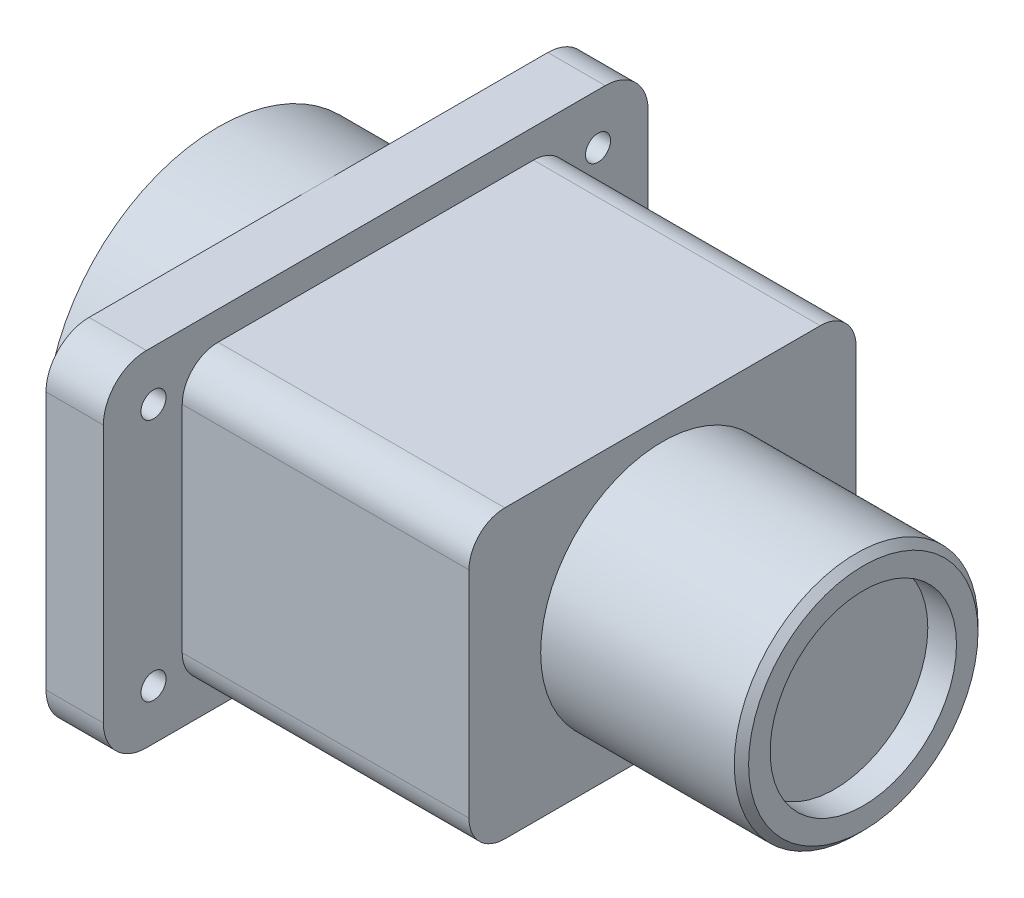
ISO-10303-21;
HEADER;
FILE_DESCRIPTION(('STEP AP214'),'2;1');
FILE_NAME('part.step','',(''),(''),'','','');
FILE_SCHEMA(('AUTOMOTIVE_DESIGN { 1 0 10303 214 1 1 1 1 }'));
ENDSEC;
DATA;
#1=APPLICATION_CONTEXT('core data for automotive mechanical design processes');
#2=APPLICATION_PROTOCOL_DEFINITION('international standard','automotive_design',2000,#1);
#3=PRODUCT_CONTEXT('',#1,'mechanical');
#4=PRODUCT('Part','Part','',(#3));
#5=PRODUCT_RELATED_PRODUCT_CATEGORY('part','',(#4));
#6=PRODUCT_DEFINITION_FORMATION('','',#4);
#7=PRODUCT_DEFINITION_CONTEXT('part definition',#1,'design');
#8=PRODUCT_DEFINITION('design','',#6,#7);
#9=PRODUCT_DEFINITION_SHAPE('','',#8);
#10=(LENGTH_UNIT() NAMED_UNIT(*) SI_UNIT(.MILLI.,.METRE.));
#11=(NAMED_UNIT(*) PLANE_ANGLE_UNIT() SI_UNIT($,.RADIAN.));
#12=(NAMED_UNIT(*) SI_UNIT($,.STERADIAN.) SOLID_ANGLE_UNIT());
#13=UNCERTAINTY_MEASURE_WITH_UNIT(LENGTH_MEASURE(1.E-05),#10,'distance_accuracy_value','');
#14=(GEOMETRIC_REPRESENTATION_CONTEXT(3) GLOBAL_UNCERTAINTY_ASSIGNED_CONTEXT((#13)) GLOBAL_UNIT_ASSIGNED_CONTEXT((#10,
#11,#12)) REPRESENTATION_CONTEXT('',''));
#15=CARTESIAN_POINT('',(0.,0.,0.));
#16=DIRECTION('',(0.,0.,1.));
#17=DIRECTION('',(1.,0.,0.));
#18=AXIS2_PLACEMENT_3D('',#15,#16,#17);
#19=CARTESIAN_POINT('',(22.,-18.,32.));
#20=DIRECTION('',(-1.,0.,0.));
#21=DIRECTION('',(0.,0.,1.));
#22=AXIS2_PLACEMENT_3D('',#19,#20,#21);
#23=PLANE('',#22);
#24=CARTESIAN_POINT('',(22.,-18.,32.));
#25=DIRECTION('',(1.,0.,0.));
#26=DIRECTION('',(0.,0.,1.));
#27=AXIS2_PLACEMENT_3D('',#24,#25,#26);
#28=CIRCLE('',#27,6.);
#29=CARTESIAN_POINT('',(22.,-17.9999999999999,38.));
#30=VERTEX_POINT('',#29);
#31=CARTESIAN_POINT('',(22.,-24.,32.));
#32=VERTEX_POINT('',#31);
#33=EDGE_CURVE('E810',#30,#32,#28,.T.);
#34=ORIENTED_EDGE('',*,*,#33,.T.);
#35=DIRECTION('',(0.,0.,-1.));
#36=VECTOR('',#35,1.);
#37=CARTESIAN_POINT('',(22.,-24.,32.));
#38=LINE('',#37,#36);
#39=CARTESIAN_POINT('',(22.,-24.,-32.));
#40=VERTEX_POINT('',#39);
#41=EDGE_CURVE('E807',#32,#40,#38,.T.);
#42=ORIENTED_EDGE('',*,*,#41,.T.);
#43=CARTESIAN_POINT('',(22.,-18.,-32.));
#44=DIRECTION('',(1.,0.,0.));
#45=DIRECTION('',(0.,0.,-1.));
#46=AXIS2_PLACEMENT_3D('',#43,#44,#45);
#47=CIRCLE('',#46,6.);
#48=CARTESIAN_POINT('',(22.,-18.,-38.));
#49=VERTEX_POINT('',#48);
#50=EDGE_CURVE('E812',#40,#49,#47,.T.);
#51=ORIENTED_EDGE('',*,*,#50,.T.);
#52=DIRECTION('',(0.,1.,0.));
#53=VECTOR('',#52,1.);
#54=CARTESIAN_POINT('',(22.,-17.9999999999999,-38.));
#55=LINE('',#54,#53);
#56=CARTESIAN_POINT('',(22.,17.9999999999999,-38.));
#57=VERTEX_POINT('',#56);
#58=EDGE_CURVE('E820',#49,#57,#55,.T.);
#59=ORIENTED_EDGE('',*,*,#58,.T.);
#60=CARTESIAN_POINT('',(22.,18.,-32.));
#61=DIRECTION('',(1.,0.,0.));
#62=DIRECTION('',(0.,0.,1.));
#63=AXIS2_PLACEMENT_3D('',#60,#61,#62);
#64=CIRCLE('',#63,6.);
#65=CARTESIAN_POINT('',(22.,24.,-32.));
#66=VERTEX_POINT('',#65);
#67=EDGE_CURVE('E819',#57,#66,#64,.T.);
#68=ORIENTED_EDGE('',*,*,#67,.T.);
#69=DIRECTION('',(0.,0.,1.));
#70=VECTOR('',#69,1.);
#71=CARTESIAN_POINT('',(22.,24.,32.));
#72=LINE('',#71,#70);
#73=CARTESIAN_POINT('',(22.,24.,32.));
#74=VERTEX_POINT('',#73);
#75=EDGE_CURVE('E822',#66,#74,#72,.T.);
#76=ORIENTED_EDGE('',*,*,#75,.T.);
#77=CARTESIAN_POINT('',(22.,18.,32.));
#78=DIRECTION('',(1.,0.,0.));
#79=DIRECTION('',(0.,0.,1.));
#80=AXIS2_PLACEMENT_3D('',#77,#78,#79);
#81=CIRCLE('',#80,6.);
#82=CARTESIAN_POINT('',(22.,18.,38.));
#83=VERTEX_POINT('',#82);
#84=EDGE_CURVE('E827',#74,#83,#81,.T.);
#85=ORIENTED_EDGE('',*,*,#84,.T.);
#86=DIRECTION('',(0.,-1.,0.));
#87=VECTOR('',#86,1.);
#88=CARTESIAN_POINT('',(22.,-17.9999999999999,38.));
#89=LINE('',#88,#87);
#90=EDGE_CURVE('E826',#83,#30,#89,.T.);
#91=ORIENTED_EDGE('',*,*,#90,.T.);
#92=EDGE_LOOP('',(#34,#42,#51,#59,#68,#76,#85,#91));
#93=FACE_BOUND('',#92,.T.);
#94=CARTESIAN_POINT('',(22.,17.,-31.));
#95=DIRECTION('',(1.,0.,0.));
#96=DIRECTION('',(0.,0.,-1.));
#97=AXIS2_PLACEMENT_3D('',#94,#95,#96);
#98=CIRCLE('',#97,1.75);
#99=CARTESIAN_POINT('',(22.,17.,-32.75));
#100=VERTEX_POINT('',#99);
#101=EDGE_CURVE('E801',#100,#100,#98,.T.);
#102=ORIENTED_EDGE('',*,*,#101,.F.);
#103=EDGE_LOOP('',(#102));
#104=FACE_BOUND('',#103,.T.);
#105=CARTESIAN_POINT('',(22.,17.,31.));
#106=DIRECTION('',(1.,0.,0.));
#107=DIRECTION('',(0.,0.,-1.));
#108=AXIS2_PLACEMENT_3D('',#105,#106,#107);
#109=CIRCLE('',#108,1.75);
#110=CARTESIAN_POINT('',(22.,17.,29.25));
#111=VERTEX_POINT('',#110);
#112=EDGE_CURVE('E236',#111,#111,#109,.T.);
#113=ORIENTED_EDGE('',*,*,#112,.F.);
#114=EDGE_LOOP('',(#113));
#115=FACE_BOUND('',#114,.T.);
#116=CARTESIAN_POINT('',(22.,-17.,31.));
#117=DIRECTION('',(1.,0.,0.));
#118=DIRECTION('',(0.,0.,-1.));
#119=AXIS2_PLACEMENT_3D('',#116,#117,#118);
#120=CIRCLE('',#119,1.75);
#121=CARTESIAN_POINT('',(22.,-17.,29.25));
#122=VERTEX_POINT('',#121);
#123=EDGE_CURVE('E783',#122,#122,#120,.T.);
#124=ORIENTED_EDGE('',*,*,#123,.F.);
#125=EDGE_LOOP('',(#124));
#126=FACE_BOUND('',#125,.T.);
#127=CARTESIAN_POINT('',(22.,-17.,-31.));
#128=DIRECTION('',(1.,0.,0.));
#129=DIRECTION('',(0.,0.,-1.));
#130=AXIS2_PLACEMENT_3D('',#127,#128,#129);
#131=CIRCLE('',#130,1.75);
#132=CARTESIAN_POINT('',(22.,-17.,-32.75));
#133=VERTEX_POINT('',#132);
#134=EDGE_CURVE('E231',#133,#133,#131,.T.);
#135=ORIENTED_EDGE('',*,*,#134,.F.);
#136=EDGE_LOOP('',(#135));
#137=FACE_BOUND('',#136,.T.);
#138=CARTESIAN_POINT('',(22.,-15.,22.));
#139=DIRECTION('',(1.,0.,0.));
#140=DIRECTION('',(0.,0.,1.));
#141=AXIS2_PLACEMENT_3D('',#138,#139,#140);
#142=CIRCLE('',#141,5.);
#143=CARTESIAN_POINT('',(22.,-15.,27.));
#144=VERTEX_POINT('',#143);
#145=CARTESIAN_POINT('',(22.,-20.,22.));
#146=VERTEX_POINT('',#145);
#147=EDGE_CURVE('E100',#144,#146,#142,.T.);
#148=ORIENTED_EDGE('',*,*,#147,.F.);
#149=DIRECTION('',(0.,-1.,0.));
#150=VECTOR('',#149,1.);
#151=CARTESIAN_POINT('',(22.,-15.,27.));
#152=LINE('',#151,#150);
#153=CARTESIAN_POINT('',(22.,15.,27.));
#154=VERTEX_POINT('',#153);
#155=EDGE_CURVE('E101',#154,#144,#152,.T.);
#156=ORIENTED_EDGE('',*,*,#155,.F.);
#157=CARTESIAN_POINT('',(22.,15.,22.));
#158=DIRECTION('',(1.,0.,0.));
#159=DIRECTION('',(0.,0.,1.));
#160=AXIS2_PLACEMENT_3D('',#157,#158,#159);
#161=CIRCLE('',#160,5.);
#162=CARTESIAN_POINT('',(22.,20.,22.));
#163=VERTEX_POINT('',#162);
#164=EDGE_CURVE('E289',#163,#154,#161,.T.);
#165=ORIENTED_EDGE('',*,*,#164,.F.);
#166=DIRECTION('',(0.,0.,1.));
#167=VECTOR('',#166,1.);
#168=CARTESIAN_POINT('',(22.,20.,22.));
#169=LINE('',#168,#167);
#170=CARTESIAN_POINT('',(22.,20.,-22.));
#171=VERTEX_POINT('',#170);
#172=EDGE_CURVE('E286',#171,#163,#169,.T.);
#173=ORIENTED_EDGE('',*,*,#172,.F.);
#174=CARTESIAN_POINT('',(22.,15.,-22.));
#175=DIRECTION('',(1.,0.,0.));
#176=DIRECTION('',(0.,0.,1.));
#177=AXIS2_PLACEMENT_3D('',#174,#175,#176);
#178=CIRCLE('',#177,5.);
#179=CARTESIAN_POINT('',(22.,15.,-27.));
#180=VERTEX_POINT('',#179);
#181=EDGE_CURVE('E279',#180,#171,#178,.T.);
#182=ORIENTED_EDGE('',*,*,#181,.F.);
#183=DIRECTION('',(0.,1.,0.));
#184=VECTOR('',#183,1.);
#185=CARTESIAN_POINT('',(22.,-15.,-27.));
#186=LINE('',#185,#184);
#187=CARTESIAN_POINT('',(22.,-15.,-27.));
#188=VERTEX_POINT('',#187);
#189=EDGE_CURVE('E266',#188,#180,#186,.T.);
#190=ORIENTED_EDGE('',*,*,#189,.F.);
#191=CARTESIAN_POINT('',(22.,-15.,-22.));
#192=DIRECTION('',(1.,0.,0.));
#193=DIRECTION('',(0.,0.,-1.));
#194=AXIS2_PLACEMENT_3D('',#191,#192,#193);
#195=CIRCLE('',#194,5.);
#196=CARTESIAN_POINT('',(22.,-20.,-22.));
#197=VERTEX_POINT('',#196);
#198=EDGE_CURVE('E271',#197,#188,#195,.T.);
#199=ORIENTED_EDGE('',*,*,#198,.F.);
#200=DIRECTION('',(0.,0.,-1.));
#201=VECTOR('',#200,1.);
#202=CARTESIAN_POINT('',(22.,-20.,22.));
#203=LINE('',#202,#201);
#204=EDGE_CURVE('E272',#146,#197,#203,.T.);
#205=ORIENTED_EDGE('',*,*,#204,.F.);
#206=EDGE_LOOP('',(#148,#156,#165,#173,#182,#190,#199,#205));
#207=FACE_BOUND('',#206,.T.);
#208=ADVANCED_FACE('F81',(#93,#104,#115,#126,#137,#207),#23,.F.);
#209=CARTESIAN_POINT('',(14.,0.,0.));
#210=DIRECTION('',(-1.,0.,0.));
#211=DIRECTION('',(0.,0.,1.));
#212=AXIS2_PLACEMENT_3D('',#209,#210,#211);
#213=CYLINDRICAL_SURFACE('',#212,24.);
#214=CARTESIAN_POINT('',(14.,0.,0.));
#215=DIRECTION('',(1.,0.,0.));
#216=DIRECTION('',(0.,0.,-1.));
#217=AXIS2_PLACEMENT_3D('',#214,#215,#216);
#218=CIRCLE('',#217,24.);
#219=CARTESIAN_POINT('',(14.,24.,0.));
#220=VERTEX_POINT('',#219);
#221=CARTESIAN_POINT('',(14.,-24.,0.));
#222=VERTEX_POINT('',#221);
#223=EDGE_CURVE('E322',#220,#222,#218,.T.);
#224=ORIENTED_EDGE('',*,*,#223,.F.);
#225=EDGE_CURVE('E423',#222,#220,#218,.T.);
#226=ORIENTED_EDGE('',*,*,#225,.F.);
#227=EDGE_LOOP('',(#224,#226));
#228=FACE_BOUND('',#227,.T.);
#229=CARTESIAN_POINT('',(0.,0.,0.));
#230=DIRECTION('',(1.,0.,0.));
#231=DIRECTION('',(0.,0.,-1.));
#232=AXIS2_PLACEMENT_3D('',#229,#230,#231);
#233=CIRCLE('',#232,24.);
#234=CARTESIAN_POINT('',(0.,0.,-24.));
#235=VERTEX_POINT('',#234);
#236=EDGE_CURVE('E416',#235,#235,#233,.T.);
#237=ORIENTED_EDGE('',*,*,#236,.T.);
#238=EDGE_LOOP('',(#237));
#239=FACE_BOUND('',#238,.T.);
#240=ADVANCED_FACE('F360',(#228,#239),#213,.T.);
#241=CARTESIAN_POINT('',(0.,0.,0.));
#242=DIRECTION('',(1.,0.,0.));
#243=DIRECTION('',(0.,0.,-1.));
#244=AXIS2_PLACEMENT_3D('',#241,#242,#243);
#245=PLANE('',#244);
#246=ORIENTED_EDGE('',*,*,#236,.F.);
#247=EDGE_LOOP('',(#246));
#248=FACE_BOUND('',#247,.T.);
#249=ADVANCED_FACE('F365',(#248),#245,.F.);
#250=CARTESIAN_POINT('',(14.,-18.,32.));
#251=DIRECTION('',(-1.,0.,0.));
#252=DIRECTION('',(0.,0.,1.));
#253=AXIS2_PLACEMENT_3D('',#250,#251,#252);
#254=PLANE('',#253);
#255=CARTESIAN_POINT('',(14.,-17.,31.));
#256=DIRECTION('',(1.,0.,0.));
#257=DIRECTION('',(0.,0.,-1.));
#258=AXIS2_PLACEMENT_3D('',#255,#256,#257);
#259=CIRCLE('',#258,1.75);
#260=CARTESIAN_POINT('',(14.,-17.,29.25));
#261=VERTEX_POINT('',#260);
#262=EDGE_CURVE('E781',#261,#261,#259,.T.);
#263=ORIENTED_EDGE('',*,*,#262,.T.);
#264=EDGE_LOOP('',(#263));
#265=FACE_BOUND('',#264,.T.);
#266=CARTESIAN_POINT('',(14.,17.,31.));
#267=DIRECTION('',(1.,0.,0.));
#268=DIRECTION('',(0.,0.,-1.));
#269=AXIS2_PLACEMENT_3D('',#266,#267,#268);
#270=CIRCLE('',#269,1.75);
#271=CARTESIAN_POINT('',(14.,17.,29.25));
#272=VERTEX_POINT('',#271);
#273=EDGE_CURVE('E790',#272,#272,#270,.T.);
#274=ORIENTED_EDGE('',*,*,#273,.T.);
#275=EDGE_LOOP('',(#274));
#276=FACE_BOUND('',#275,.T.);
#277=DIRECTION('',(0.,0.,1.));
#278=VECTOR('',#277,1.);
#279=CARTESIAN_POINT('',(14.,24.,32.));
#280=LINE('',#279,#278);
#281=CARTESIAN_POINT('',(14.,24.,32.));
#282=VERTEX_POINT('',#281);
#283=EDGE_CURVE('E847',#220,#282,#280,.T.);
#284=ORIENTED_EDGE('',*,*,#283,.F.);
#285=ORIENTED_EDGE('',*,*,#223,.T.);
#286=DIRECTION('',(0.,0.,-1.));
#287=VECTOR('',#286,1.);
#288=CARTESIAN_POINT('',(14.,-24.,32.));
#289=LINE('',#288,#287);
#290=CARTESIAN_POINT('',(14.,-24.,32.));
#291=VERTEX_POINT('',#290);
#292=EDGE_CURVE('E840',#291,#222,#289,.T.);
#293=ORIENTED_EDGE('',*,*,#292,.F.);
#294=CARTESIAN_POINT('',(14.,-18.,32.));
#295=DIRECTION('',(1.,0.,0.));
#296=DIRECTION('',(0.,0.,1.));
#297=AXIS2_PLACEMENT_3D('',#294,#295,#296);
#298=CIRCLE('',#297,6.);
#299=CARTESIAN_POINT('',(14.,-17.9999999999999,38.));
#300=VERTEX_POINT('',#299);
#301=EDGE_CURVE('E802',#300,#291,#298,.T.);
#302=ORIENTED_EDGE('',*,*,#301,.F.);
#303=DIRECTION('',(0.,-1.,0.));
#304=VECTOR('',#303,1.);
#305=CARTESIAN_POINT('',(14.,-17.9999999999999,38.));
#306=LINE('',#305,#304);
#307=CARTESIAN_POINT('',(14.,18.,38.));
#308=VERTEX_POINT('',#307);
#309=EDGE_CURVE('E811',#308,#300,#306,.T.);
#310=ORIENTED_EDGE('',*,*,#309,.F.);
#311=CARTESIAN_POINT('',(14.,18.,32.));
#312=DIRECTION('',(1.,0.,0.));
#313=DIRECTION('',(0.,0.,1.));
#314=AXIS2_PLACEMENT_3D('',#311,#312,#313);
#315=CIRCLE('',#314,6.);
#316=EDGE_CURVE('E854',#282,#308,#315,.T.);
#317=ORIENTED_EDGE('',*,*,#316,.F.);
#318=EDGE_LOOP('',(#284,#285,#293,#302,#310,#317));
#319=FACE_BOUND('',#318,.T.);
#320=ADVANCED_FACE('F380',(#265,#276,#319),#254,.T.);
#321=CARTESIAN_POINT('',(22.,-18.,32.));
#322=DIRECTION('',(-1.,0.,0.));
#323=DIRECTION('',(0.,0.,1.));
#324=AXIS2_PLACEMENT_3D('',#321,#322,#323);
#325=CYLINDRICAL_SURFACE('',#324,6.);
#326=ORIENTED_EDGE('',*,*,#301,.T.);
#327=DIRECTION('',(-1.,0.,0.));
#328=VECTOR('',#327,1.);
#329=CARTESIAN_POINT('',(22.,-24.,32.));
#330=LINE('',#329,#328);
#331=EDGE_CURVE('E425',#32,#291,#330,.T.);
#332=ORIENTED_EDGE('',*,*,#331,.F.);
#333=ORIENTED_EDGE('',*,*,#33,.F.);
#334=DIRECTION('',(-1.,0.,0.));
#335=VECTOR('',#334,1.);
#336=CARTESIAN_POINT('',(22.,-17.9999999999999,38.));
#337=LINE('',#336,#335);
#338=EDGE_CURVE('E831',#30,#300,#337,.T.);
#339=ORIENTED_EDGE('',*,*,#338,.T.);
#340=EDGE_LOOP('',(#326,#332,#333,#339));
#341=FACE_BOUND('',#340,.T.);
#342=ADVANCED_FACE('F404',(#341),#325,.T.);
#343=CARTESIAN_POINT('',(22.,-24.,32.));
#344=DIRECTION('',(0.,1.,0.));
#345=DIRECTION('',(0.,0.,1.));
#346=AXIS2_PLACEMENT_3D('',#343,#344,#345);
#347=PLANE('',#346);
#348=ORIENTED_EDGE('',*,*,#292,.T.);
#349=CARTESIAN_POINT('',(14.,-24.,-32.));
#350=VERTEX_POINT('',#349);
#351=EDGE_CURVE('E836',#222,#350,#289,.T.);
#352=ORIENTED_EDGE('',*,*,#351,.T.);
#353=DIRECTION('',(-1.,0.,0.));
#354=VECTOR('',#353,1.);
#355=CARTESIAN_POINT('',(22.,-24.,-32.));
#356=LINE('',#355,#354);
#357=EDGE_CURVE('E429',#40,#350,#356,.T.);
#358=ORIENTED_EDGE('',*,*,#357,.F.);
#359=ORIENTED_EDGE('',*,*,#41,.F.);
#360=ORIENTED_EDGE('',*,*,#331,.T.);
#361=EDGE_LOOP('',(#348,#352,#358,#359,#360));
#362=FACE_BOUND('',#361,.T.);
#363=ADVANCED_FACE('F399',(#362),#347,.F.);
#364=CARTESIAN_POINT('',(22.,-18.,-32.));
#365=DIRECTION('',(-1.,0.,0.));
#366=DIRECTION('',(0.,0.,1.));
#367=AXIS2_PLACEMENT_3D('',#364,#365,#366);
#368=CYLINDRICAL_SURFACE('',#367,6.);
#369=CARTESIAN_POINT('',(14.,-18.,-32.));
#370=DIRECTION('',(1.,0.,0.));
#371=DIRECTION('',(0.,0.,-1.));
#372=AXIS2_PLACEMENT_3D('',#369,#370,#371);
#373=CIRCLE('',#372,6.);
#374=CARTESIAN_POINT('',(14.,-18.,-38.));
#375=VERTEX_POINT('',#374);
#376=EDGE_CURVE('E842',#350,#375,#373,.T.);
#377=ORIENTED_EDGE('',*,*,#376,.T.);
#378=DIRECTION('',(-1.,0.,0.));
#379=VECTOR('',#378,1.);
#380=CARTESIAN_POINT('',(22.,-18.,-38.));
#381=LINE('',#380,#379);
#382=EDGE_CURVE('E878',#49,#375,#381,.T.);
#383=ORIENTED_EDGE('',*,*,#382,.F.);
#384=ORIENTED_EDGE('',*,*,#50,.F.);
#385=ORIENTED_EDGE('',*,*,#357,.T.);
#386=EDGE_LOOP('',(#377,#383,#384,#385));
#387=FACE_BOUND('',#386,.T.);
#388=ADVANCED_FACE('F396',(#387),#368,.T.);
#389=CARTESIAN_POINT('',(22.,-17.9999999999999,-38.));
#390=DIRECTION('',(0.,0.,1.));
#391=DIRECTION('',(1.,0.,0.));
#392=AXIS2_PLACEMENT_3D('',#389,#390,#391);
#393=PLANE('',#392);
#394=DIRECTION('',(0.,1.,0.));
#395=VECTOR('',#394,1.);
#396=CARTESIAN_POINT('',(14.,-17.9999999999999,-38.));
#397=LINE('',#396,#395);
#398=CARTESIAN_POINT('',(14.,17.9999999999999,-38.));
#399=VERTEX_POINT('',#398);
#400=EDGE_CURVE('E844',#375,#399,#397,.T.);
#401=ORIENTED_EDGE('',*,*,#400,.T.);
#402=DIRECTION('',(-1.,0.,0.));
#403=VECTOR('',#402,1.);
#404=CARTESIAN_POINT('',(22.,17.9999999999999,-38.));
#405=LINE('',#404,#403);
#406=EDGE_CURVE('E874',#57,#399,#405,.T.);
#407=ORIENTED_EDGE('',*,*,#406,.F.);
#408=ORIENTED_EDGE('',*,*,#58,.F.);
#409=ORIENTED_EDGE('',*,*,#382,.T.);
#410=EDGE_LOOP('',(#401,#407,#408,#409));
#411=FACE_BOUND('',#410,.T.);
#412=ADVANCED_FACE('F391',(#411),#393,.F.);
#413=CARTESIAN_POINT('',(22.,18.,-32.));
#414=DIRECTION('',(-1.,0.,0.));
#415=DIRECTION('',(0.,0.,1.));
#416=AXIS2_PLACEMENT_3D('',#413,#414,#415);
#417=CYLINDRICAL_SURFACE('',#416,6.);
#418=CARTESIAN_POINT('',(14.,18.,-32.));
#419=DIRECTION('',(1.,0.,0.));
#420=DIRECTION('',(0.,0.,1.));
#421=AXIS2_PLACEMENT_3D('',#418,#419,#420);
#422=CIRCLE('',#421,6.);
#423=CARTESIAN_POINT('',(14.,24.,-32.));
#424=VERTEX_POINT('',#423);
#425=EDGE_CURVE('E846',#399,#424,#422,.T.);
#426=ORIENTED_EDGE('',*,*,#425,.T.);
#427=DIRECTION('',(-1.,0.,0.));
#428=VECTOR('',#427,1.);
#429=CARTESIAN_POINT('',(22.,24.,-32.));
#430=LINE('',#429,#428);
#431=EDGE_CURVE('E871',#66,#424,#430,.T.);
#432=ORIENTED_EDGE('',*,*,#431,.F.);
#433=ORIENTED_EDGE('',*,*,#67,.F.);
#434=ORIENTED_EDGE('',*,*,#406,.T.);
#435=EDGE_LOOP('',(#426,#432,#433,#434));
#436=FACE_BOUND('',#435,.T.);
#437=ADVANCED_FACE('F389',(#436),#417,.T.);
#438=CARTESIAN_POINT('',(22.,24.,32.));
#439=DIRECTION('',(0.,-1.,0.));
#440=DIRECTION('',(0.,0.,-1.));
#441=AXIS2_PLACEMENT_3D('',#438,#439,#440);
#442=PLANE('',#441);
#443=EDGE_CURVE('E851',#424,#220,#280,.T.);
#444=ORIENTED_EDGE('',*,*,#443,.T.);
#445=ORIENTED_EDGE('',*,*,#283,.T.);
#446=DIRECTION('',(-1.,0.,0.));
#447=VECTOR('',#446,1.);
#448=CARTESIAN_POINT('',(22.,24.,32.));
#449=LINE('',#448,#447);
#450=EDGE_CURVE('E870',#74,#282,#449,.T.);
#451=ORIENTED_EDGE('',*,*,#450,.F.);
#452=ORIENTED_EDGE('',*,*,#75,.F.);
#453=ORIENTED_EDGE('',*,*,#431,.T.);
#454=EDGE_LOOP('',(#444,#445,#451,#452,#453));
#455=FACE_BOUND('',#454,.T.);
#456=ADVANCED_FACE('F383',(#455),#442,.F.);
#457=CARTESIAN_POINT('',(22.,18.,32.));
#458=DIRECTION('',(-1.,0.,0.));
#459=DIRECTION('',(0.,0.,1.));
#460=AXIS2_PLACEMENT_3D('',#457,#458,#459);
#461=CYLINDRICAL_SURFACE('',#460,6.);
#462=ORIENTED_EDGE('',*,*,#316,.T.);
#463=DIRECTION('',(-1.,0.,0.));
#464=VECTOR('',#463,1.);
#465=CARTESIAN_POINT('',(22.,18.,38.));
#466=LINE('',#465,#464);
#467=EDGE_CURVE('E861',#83,#308,#466,.T.);
#468=ORIENTED_EDGE('',*,*,#467,.F.);
#469=ORIENTED_EDGE('',*,*,#84,.F.);
#470=ORIENTED_EDGE('',*,*,#450,.T.);
#471=EDGE_LOOP('',(#462,#468,#469,#470));
#472=FACE_BOUND('',#471,.T.);
#473=ADVANCED_FACE('F379',(#472),#461,.T.);
#474=CARTESIAN_POINT('',(22.,-17.9999999999999,38.));
#475=DIRECTION('',(0.,0.,-1.));
#476=DIRECTION('',(-1.,0.,0.));
#477=AXIS2_PLACEMENT_3D('',#474,#475,#476);
#478=PLANE('',#477);
#479=ORIENTED_EDGE('',*,*,#309,.T.);
#480=ORIENTED_EDGE('',*,*,#338,.F.);
#481=ORIENTED_EDGE('',*,*,#90,.F.);
#482=ORIENTED_EDGE('',*,*,#467,.T.);
#483=EDGE_LOOP('',(#479,#480,#481,#482));
#484=FACE_BOUND('',#483,.T.);
#485=ADVANCED_FACE('F374',(#484),#478,.F.);
#486=CARTESIAN_POINT('',(14.,-17.,-31.));
#487=DIRECTION('',(1.,0.,0.));
#488=DIRECTION('',(0.,0.,-1.));
#489=AXIS2_PLACEMENT_3D('',#486,#487,#488);
#490=CIRCLE('',#489,1.75);
#491=CARTESIAN_POINT('',(14.,-17.,-32.75));
#492=VERTEX_POINT('',#491);
#493=EDGE_CURVE('E221',#492,#492,#490,.T.);
#494=ORIENTED_EDGE('',*,*,#493,.T.);
#495=EDGE_LOOP('',(#494));
#496=FACE_BOUND('',#495,.T.);
#497=CARTESIAN_POINT('',(14.,17.,-31.));
#498=DIRECTION('',(1.,0.,0.));
#499=DIRECTION('',(0.,0.,-1.));
#500=AXIS2_PLACEMENT_3D('',#497,#498,#499);
#501=CIRCLE('',#500,1.75);
#502=CARTESIAN_POINT('',(14.,17.,-32.75));
#503=VERTEX_POINT('',#502);
#504=EDGE_CURVE('E797',#503,#503,#501,.T.);
#505=ORIENTED_EDGE('',*,*,#504,.T.);
#506=EDGE_LOOP('',(#505));
#507=FACE_BOUND('',#506,.T.);
#508=ORIENTED_EDGE('',*,*,#351,.F.);
#509=ORIENTED_EDGE('',*,*,#225,.T.);
#510=ORIENTED_EDGE('',*,*,#443,.F.);
#511=ORIENTED_EDGE('',*,*,#425,.F.);
#512=ORIENTED_EDGE('',*,*,#400,.F.);
#513=ORIENTED_EDGE('',*,*,#376,.F.);
#514=EDGE_LOOP('',(#508,#509,#510,#511,#512,#513));
#515=FACE_BOUND('',#514,.T.);
#516=ADVANCED_FACE('F375',(#496,#507,#515),#254,.T.);
#517=CARTESIAN_POINT('',(14.,17.,-31.));
#518=DIRECTION('',(1.,0.,0.));
#519=DIRECTION('',(0.,0.,-1.));
#520=AXIS2_PLACEMENT_3D('',#517,#518,#519);
#521=CYLINDRICAL_SURFACE('',#520,1.75);
#522=ORIENTED_EDGE('',*,*,#504,.F.);
#523=EDGE_LOOP('',(#522));
#524=FACE_BOUND('',#523,.T.);
#525=ORIENTED_EDGE('',*,*,#101,.T.);
#526=EDGE_LOOP('',(#525));
#527=FACE_BOUND('',#526,.T.);
#528=ADVANCED_FACE('F367',(#524,#527),#521,.F.);
#529=CARTESIAN_POINT('',(14.,-17.,-31.));
#530=DIRECTION('',(1.,0.,0.));
#531=DIRECTION('',(0.,0.,-1.));
#532=AXIS2_PLACEMENT_3D('',#529,#530,#531);
#533=CYLINDRICAL_SURFACE('',#532,1.75);
#534=ORIENTED_EDGE('',*,*,#493,.F.);
#535=EDGE_LOOP('',(#534));
#536=FACE_BOUND('',#535,.T.);
#537=ORIENTED_EDGE('',*,*,#134,.T.);
#538=EDGE_LOOP('',(#537));
#539=FACE_BOUND('',#538,.T.);
#540=ADVANCED_FACE('F511',(#536,#539),#533,.F.);
#541=CARTESIAN_POINT('',(14.,17.,31.));
#542=DIRECTION('',(1.,0.,0.));
#543=DIRECTION('',(0.,0.,-1.));
#544=AXIS2_PLACEMENT_3D('',#541,#542,#543);
#545=CYLINDRICAL_SURFACE('',#544,1.75);
#546=ORIENTED_EDGE('',*,*,#273,.F.);
#547=EDGE_LOOP('',(#546));
#548=FACE_BOUND('',#547,.T.);
#549=ORIENTED_EDGE('',*,*,#112,.T.);
#550=EDGE_LOOP('',(#549));
#551=FACE_BOUND('',#550,.T.);
#552=ADVANCED_FACE('F525',(#548,#551),#545,.F.);
#553=CARTESIAN_POINT('',(14.,-17.,31.));
#554=DIRECTION('',(1.,0.,0.));
#555=DIRECTION('',(0.,0.,-1.));
#556=AXIS2_PLACEMENT_3D('',#553,#554,#555);
#557=CYLINDRICAL_SURFACE('',#556,1.75);
#558=ORIENTED_EDGE('',*,*,#262,.F.);
#559=EDGE_LOOP('',(#558));
#560=FACE_BOUND('',#559,.T.);
#561=ORIENTED_EDGE('',*,*,#123,.T.);
#562=EDGE_LOOP('',(#561));
#563=FACE_BOUND('',#562,.T.);
#564=ADVANCED_FACE('F533',(#560,#563),#557,.F.);
#565=CARTESIAN_POINT('',(62.,-15.,22.));
#566=DIRECTION('',(-1.,0.,0.));
#567=DIRECTION('',(0.,0.,1.));
#568=AXIS2_PLACEMENT_3D('',#565,#566,#567);
#569=CYLINDRICAL_SURFACE('',#568,5.);
#570=ORIENTED_EDGE('',*,*,#147,.T.);
#571=DIRECTION('',(-1.,0.,0.));
#572=VECTOR('',#571,1.);
#573=CARTESIAN_POINT('',(62.,-20.,22.));
#574=LINE('',#573,#572);
#575=CARTESIAN_POINT('',(62.,-20.,22.));
#576=VERTEX_POINT('',#575);
#577=EDGE_CURVE('E204',#576,#146,#574,.T.);
#578=ORIENTED_EDGE('',*,*,#577,.F.);
#579=CARTESIAN_POINT('',(62.,-15.,22.));
#580=DIRECTION('',(1.,0.,0.));
#581=DIRECTION('',(0.,0.,1.));
#582=AXIS2_PLACEMENT_3D('',#579,#580,#581);
#583=CIRCLE('',#582,5.);
#584=CARTESIAN_POINT('',(62.,-15.,27.));
#585=VERTEX_POINT('',#584);
#586=EDGE_CURVE('E211',#585,#576,#583,.T.);
#587=ORIENTED_EDGE('',*,*,#586,.F.);
#588=DIRECTION('',(-1.,0.,0.));
#589=VECTOR('',#588,1.);
#590=CARTESIAN_POINT('',(62.,-15.,27.));
#591=LINE('',#590,#589);
#592=EDGE_CURVE('E294',#585,#144,#591,.T.);
#593=ORIENTED_EDGE('',*,*,#592,.T.);
#594=EDGE_LOOP('',(#570,#578,#587,#593));
#595=FACE_BOUND('',#594,.T.);
#596=ADVANCED_FACE('F225',(#595),#569,.T.);
#597=CARTESIAN_POINT('',(62.,-20.,22.));
#598=DIRECTION('',(0.,1.,0.));
#599=DIRECTION('',(0.,0.,1.));
#600=AXIS2_PLACEMENT_3D('',#597,#598,#599);
#601=PLANE('',#600);
#602=ORIENTED_EDGE('',*,*,#204,.T.);
#603=DIRECTION('',(-1.,0.,0.));
#604=VECTOR('',#603,1.);
#605=CARTESIAN_POINT('',(62.,-20.,-22.));
#606=LINE('',#605,#604);
#607=CARTESIAN_POINT('',(62.,-20.,-22.));
#608=VERTEX_POINT('',#607);
#609=EDGE_CURVE('E206',#608,#197,#606,.T.);
#610=ORIENTED_EDGE('',*,*,#609,.F.);
#611=DIRECTION('',(0.,0.,-1.));
#612=VECTOR('',#611,1.);
#613=CARTESIAN_POINT('',(62.,-20.,22.));
#614=LINE('',#613,#612);
#615=EDGE_CURVE('E200',#576,#608,#614,.T.);
#616=ORIENTED_EDGE('',*,*,#615,.F.);
#617=ORIENTED_EDGE('',*,*,#577,.T.);
#618=EDGE_LOOP('',(#602,#610,#616,#617));
#619=FACE_BOUND('',#618,.T.);
#620=ADVANCED_FACE('F205',(#619),#601,.F.);
#621=CARTESIAN_POINT('',(62.,-15.,-22.));
#622=DIRECTION('',(-1.,0.,0.));
#623=DIRECTION('',(0.,0.,1.));
#624=AXIS2_PLACEMENT_3D('',#621,#622,#623);
#625=CYLINDRICAL_SURFACE('',#624,5.);
#626=ORIENTED_EDGE('',*,*,#198,.T.);
#627=DIRECTION('',(-1.,0.,0.));
#628=VECTOR('',#627,1.);
#629=CARTESIAN_POINT('',(62.,-15.,-27.));
#630=LINE('',#629,#628);
#631=CARTESIAN_POINT('',(62.,-15.,-27.));
#632=VERTEX_POINT('',#631);
#633=EDGE_CURVE('E232',#632,#188,#630,.T.);
#634=ORIENTED_EDGE('',*,*,#633,.F.);
#635=CARTESIAN_POINT('',(62.,-15.,-22.));
#636=DIRECTION('',(1.,0.,0.));
#637=DIRECTION('',(0.,0.,-1.));
#638=AXIS2_PLACEMENT_3D('',#635,#636,#637);
#639=CIRCLE('',#638,5.);
#640=EDGE_CURVE('E209',#608,#632,#639,.T.);
#641=ORIENTED_EDGE('',*,*,#640,.F.);
#642=ORIENTED_EDGE('',*,*,#609,.T.);
#643=EDGE_LOOP('',(#626,#634,#641,#642));
#644=FACE_BOUND('',#643,.T.);
#645=ADVANCED_FACE('F269',(#644),#625,.T.);
#646=CARTESIAN_POINT('',(62.,-15.,-27.));
#647=DIRECTION('',(0.,0.,1.));
#648=DIRECTION('',(1.,0.,0.));
#649=AXIS2_PLACEMENT_3D('',#646,#647,#648);
#650=PLANE('',#649);
#651=ORIENTED_EDGE('',*,*,#189,.T.);
#652=DIRECTION('',(-1.,0.,0.));
#653=VECTOR('',#652,1.);
#654=CARTESIAN_POINT('',(62.,15.,-27.));
#655=LINE('',#654,#653);
#656=CARTESIAN_POINT('',(62.,15.,-27.));
#657=VERTEX_POINT('',#656);
#658=EDGE_CURVE('E255',#657,#180,#655,.T.);
#659=ORIENTED_EDGE('',*,*,#658,.F.);
#660=DIRECTION('',(0.,1.,0.));
#661=VECTOR('',#660,1.);
#662=CARTESIAN_POINT('',(62.,-15.,-27.));
#663=LINE('',#662,#661);
#664=EDGE_CURVE('E270',#632,#657,#663,.T.);
#665=ORIENTED_EDGE('',*,*,#664,.F.);
#666=ORIENTED_EDGE('',*,*,#633,.T.);
#667=EDGE_LOOP('',(#651,#659,#665,#666));
#668=FACE_BOUND('',#667,.T.);
#669=ADVANCED_FACE('F262',(#668),#650,.F.);
#670=CARTESIAN_POINT('',(62.,15.,-22.));
#671=DIRECTION('',(-1.,0.,0.));
#672=DIRECTION('',(0.,0.,1.));
#673=AXIS2_PLACEMENT_3D('',#670,#671,#672);
#674=CYLINDRICAL_SURFACE('',#673,5.);
#675=ORIENTED_EDGE('',*,*,#181,.T.);
#676=DIRECTION('',(-1.,0.,0.));
#677=VECTOR('',#676,1.);
#678=CARTESIAN_POINT('',(62.,20.,-22.));
#679=LINE('',#678,#677);
#680=CARTESIAN_POINT('',(62.,20.,-22.));
#681=VERTEX_POINT('',#680);
#682=EDGE_CURVE('E247',#681,#171,#679,.T.);
#683=ORIENTED_EDGE('',*,*,#682,.F.);
#684=CARTESIAN_POINT('',(62.,15.,-22.));
#685=DIRECTION('',(1.,0.,0.));
#686=DIRECTION('',(0.,0.,1.));
#687=AXIS2_PLACEMENT_3D('',#684,#685,#686);
#688=CIRCLE('',#687,5.);
#689=EDGE_CURVE('E329',#657,#681,#688,.T.);
#690=ORIENTED_EDGE('',*,*,#689,.F.);
#691=ORIENTED_EDGE('',*,*,#658,.T.);
#692=EDGE_LOOP('',(#675,#683,#690,#691));
#693=FACE_BOUND('',#692,.T.);
#694=ADVANCED_FACE('F573',(#693),#674,.T.);
#695=CARTESIAN_POINT('',(62.,20.,22.));
#696=DIRECTION('',(0.,-1.,0.));
#697=DIRECTION('',(0.,0.,-1.));
#698=AXIS2_PLACEMENT_3D('',#695,#696,#697);
#699=PLANE('',#698);
#700=ORIENTED_EDGE('',*,*,#172,.T.);
#701=DIRECTION('',(-1.,0.,0.));
#702=VECTOR('',#701,1.);
#703=CARTESIAN_POINT('',(62.,20.,22.));
#704=LINE('',#703,#702);
#705=CARTESIAN_POINT('',(62.,20.,22.));
#706=VERTEX_POINT('',#705);
#707=EDGE_CURVE('E241',#706,#163,#704,.T.);
#708=ORIENTED_EDGE('',*,*,#707,.F.);
#709=DIRECTION('',(0.,0.,1.));
#710=VECTOR('',#709,1.);
#711=CARTESIAN_POINT('',(62.,20.,22.));
#712=LINE('',#711,#710);
#713=EDGE_CURVE('E303',#681,#706,#712,.T.);
#714=ORIENTED_EDGE('',*,*,#713,.F.);
#715=ORIENTED_EDGE('',*,*,#682,.T.);
#716=EDGE_LOOP('',(#700,#708,#714,#715));
#717=FACE_BOUND('',#716,.T.);
#718=ADVANCED_FACE('F341',(#717),#699,.F.);
#719=CARTESIAN_POINT('',(62.,15.,22.));
#720=DIRECTION('',(-1.,0.,0.));
#721=DIRECTION('',(0.,0.,1.));
#722=AXIS2_PLACEMENT_3D('',#719,#720,#721);
#723=CYLINDRICAL_SURFACE('',#722,5.);
#724=ORIENTED_EDGE('',*,*,#164,.T.);
#725=DIRECTION('',(-1.,0.,0.));
#726=VECTOR('',#725,1.);
#727=CARTESIAN_POINT('',(62.,15.,27.));
#728=LINE('',#727,#726);
#729=CARTESIAN_POINT('',(62.,15.,27.));
#730=VERTEX_POINT('',#729);
#731=EDGE_CURVE('E248',#730,#154,#728,.T.);
#732=ORIENTED_EDGE('',*,*,#731,.F.);
#733=CARTESIAN_POINT('',(62.,15.,22.));
#734=DIRECTION('',(1.,0.,0.));
#735=DIRECTION('',(0.,0.,1.));
#736=AXIS2_PLACEMENT_3D('',#733,#734,#735);
#737=CIRCLE('',#736,5.);
#738=EDGE_CURVE('E297',#706,#730,#737,.T.);
#739=ORIENTED_EDGE('',*,*,#738,.F.);
#740=ORIENTED_EDGE('',*,*,#707,.T.);
#741=EDGE_LOOP('',(#724,#732,#739,#740));
#742=FACE_BOUND('',#741,.T.);
#743=ADVANCED_FACE('F342',(#742),#723,.T.);
#744=CARTESIAN_POINT('',(62.,-15.,27.));
#745=DIRECTION('',(0.,0.,-1.));
#746=DIRECTION('',(-1.,0.,0.));
#747=AXIS2_PLACEMENT_3D('',#744,#745,#746);
#748=PLANE('',#747);
#749=ORIENTED_EDGE('',*,*,#155,.T.);
#750=ORIENTED_EDGE('',*,*,#592,.F.);
#751=DIRECTION('',(0.,-1.,0.));
#752=VECTOR('',#751,1.);
#753=CARTESIAN_POINT('',(62.,-15.,27.));
#754=LINE('',#753,#752);
#755=EDGE_CURVE('E216',#730,#585,#754,.T.);
#756=ORIENTED_EDGE('',*,*,#755,.F.);
#757=ORIENTED_EDGE('',*,*,#731,.T.);
#758=EDGE_LOOP('',(#749,#750,#756,#757));
#759=FACE_BOUND('',#758,.T.);
#760=ADVANCED_FACE('F344',(#759),#748,.F.);
#761=CARTESIAN_POINT('',(62.,-15.,22.));
#762=DIRECTION('',(-1.,0.,0.));
#763=DIRECTION('',(0.,0.,1.));
#764=AXIS2_PLACEMENT_3D('',#761,#762,#763);
#765=PLANE('',#764);
#766=CARTESIAN_POINT('',(62.,0.,0.));
#767=DIRECTION('',(1.,0.,0.));
#768=DIRECTION('',(0.,0.,-1.));
#769=AXIS2_PLACEMENT_3D('',#766,#767,#768);
#770=CIRCLE('',#769,17.);
#771=CARTESIAN_POINT('',(62.,0.,-17.));
#772=VERTEX_POINT('',#771);
#773=EDGE_CURVE('E321',#772,#772,#770,.T.);
#774=ORIENTED_EDGE('',*,*,#773,.F.);
#775=EDGE_LOOP('',(#774));
#776=FACE_BOUND('',#775,.T.);
#777=ORIENTED_EDGE('',*,*,#586,.T.);
#778=ORIENTED_EDGE('',*,*,#615,.T.);
#779=ORIENTED_EDGE('',*,*,#640,.T.);
#780=ORIENTED_EDGE('',*,*,#664,.T.);
#781=ORIENTED_EDGE('',*,*,#689,.T.);
#782=ORIENTED_EDGE('',*,*,#713,.T.);
#783=ORIENTED_EDGE('',*,*,#738,.T.);
#784=ORIENTED_EDGE('',*,*,#755,.T.);
#785=EDGE_LOOP('',(#777,#778,#779,#780,#781,#782,#783,#784));
#786=FACE_BOUND('',#785,.T.);
#787=ADVANCED_FACE('F212',(#776,#786),#765,.F.);
#788=CARTESIAN_POINT('',(90.,0.,0.));
#789=DIRECTION('',(-1.,0.,0.));
#790=DIRECTION('',(0.,0.,1.));
#791=AXIS2_PLACEMENT_3D('',#788,#789,#790);
#792=CYLINDRICAL_SURFACE('',#791,17.);
#793=CARTESIAN_POINT('',(89.,0.,0.));
#794=DIRECTION('',(1.,0.,0.));
#795=DIRECTION('',(0.,0.,-1.));
#796=AXIS2_PLACEMENT_3D('',#793,#794,#795);
#797=CIRCLE('',#796,17.);
#798=CARTESIAN_POINT('',(89.,0.,-17.));
#799=VERTEX_POINT('',#798);
#800=EDGE_CURVE('E13',#799,#799,#797,.F.);
#801=ORIENTED_EDGE('',*,*,#800,.T.);
#802=EDGE_LOOP('',(#801));
#803=FACE_BOUND('',#802,.T.);
#804=ORIENTED_EDGE('',*,*,#773,.T.);
#805=EDGE_LOOP('',(#804));
#806=FACE_BOUND('',#805,.T.);
#807=ADVANCED_FACE('F351',(#803,#806),#792,.T.);
#808=CARTESIAN_POINT('',(90.,0.,0.));
#809=DIRECTION('',(1.,0.,0.));
#810=DIRECTION('',(0.,0.,-1.));
#811=AXIS2_PLACEMENT_3D('',#808,#809,#810);
#812=PLANE('',#811);
#813=CARTESIAN_POINT('',(90.,0.,0.));
#814=DIRECTION('',(1.,0.,0.));
#815=DIRECTION('',(0.,0.,-1.));
#816=AXIS2_PLACEMENT_3D('',#813,#814,#815);
#817=CIRCLE('',#816,16.);
#818=CARTESIAN_POINT('',(90.,0.,-16.));
#819=VERTEX_POINT('',#818);
#820=EDGE_CURVE('E89',#819,#819,#817,.T.);
#821=ORIENTED_EDGE('',*,*,#820,.T.);
#822=EDGE_LOOP('',(#821));
#823=FACE_BOUND('',#822,.T.);
#824=CARTESIAN_POINT('',(90.,0.,0.));
#825=DIRECTION('',(1.,0.,0.));
#826=DIRECTION('',(0.,0.,-1.));
#827=AXIS2_PLACEMENT_3D('',#824,#825,#826);
#828=CIRCLE('',#827,13.);
#829=CARTESIAN_POINT('',(90.,0.,-13.));
#830=VERTEX_POINT('',#829);
#831=EDGE_CURVE('E315',#830,#830,#828,.T.);
#832=ORIENTED_EDGE('',*,*,#831,.F.);
#833=EDGE_LOOP('',(#832));
#834=FACE_BOUND('',#833,.T.);
#835=ADVANCED_FACE('F438',(#823,#834),#812,.T.);
#836=CARTESIAN_POINT('',(86.,0.,0.));
#837=DIRECTION('',(1.,0.,0.));
#838=DIRECTION('',(0.,0.,-1.));
#839=AXIS2_PLACEMENT_3D('',#836,#837,#838);
#840=CYLINDRICAL_SURFACE('',#839,13.);
#841=CARTESIAN_POINT('',(86.,0.,0.));
#842=DIRECTION('',(1.,0.,0.));
#843=DIRECTION('',(0.,0.,-1.));
#844=AXIS2_PLACEMENT_3D('',#841,#842,#843);
#845=CIRCLE('',#844,13.);
#846=CARTESIAN_POINT('',(86.,0.,-13.));
#847=VERTEX_POINT('',#846);
#848=EDGE_CURVE('E306',#847,#847,#845,.T.);
#849=ORIENTED_EDGE('',*,*,#848,.F.);
#850=EDGE_LOOP('',(#849));
#851=FACE_BOUND('',#850,.T.);
#852=ORIENTED_EDGE('',*,*,#831,.T.);
#853=EDGE_LOOP('',(#852));
#854=FACE_BOUND('',#853,.T.);
#855=ADVANCED_FACE('F450',(#851,#854),#840,.F.);
#856=CARTESIAN_POINT('',(86.,0.,0.));
#857=DIRECTION('',(1.,0.,0.));
#858=DIRECTION('',(0.,0.,-1.));
#859=AXIS2_PLACEMENT_3D('',#856,#857,#858);
#860=PLANE('',#859);
#861=ORIENTED_EDGE('',*,*,#848,.T.);
#862=EDGE_LOOP('',(#861));
#863=FACE_BOUND('',#862,.T.);
#864=ADVANCED_FACE('F444',(#863),#860,.T.);
#865=CARTESIAN_POINT('',(90.,0.,0.));
#866=DIRECTION('',(-1.,0.,0.));
#867=DIRECTION('',(0.,0.,1.));
#868=AXIS2_PLACEMENT_3D('',#865,#866,#867);
#869=CONICAL_SURFACE('',#868,16.,0.785398163397448);
#870=ORIENTED_EDGE('',*,*,#800,.F.);
#871=EDGE_LOOP('',(#870));
#872=FACE_BOUND('',#871,.T.);
#873=ORIENTED_EDGE('',*,*,#820,.F.);
#874=EDGE_LOOP('',(#873));
#875=FACE_BOUND('',#874,.T.);
#876=ADVANCED_FACE('F83',(#872,#875),#869,.T.);
#877=CLOSED_SHELL('',(#208,#240,#249,#320,#342,#363,#388,#412,#437,#456,#473,#485,#516,#528,
#540,#552,#564,#596,#620,#645,#669,#694,#718,#743,#760,#787,#807,#835,#855,#864,#876));
#878=MANIFOLD_SOLID_BREP('B2',#877);
#879=ADVANCED_BREP_SHAPE_REPRESENTATION('',(#18,#878),#14);
#880=SHAPE_DEFINITION_REPRESENTATION(#9,#879);
ENDSEC;
END-ISO-10303-21;
